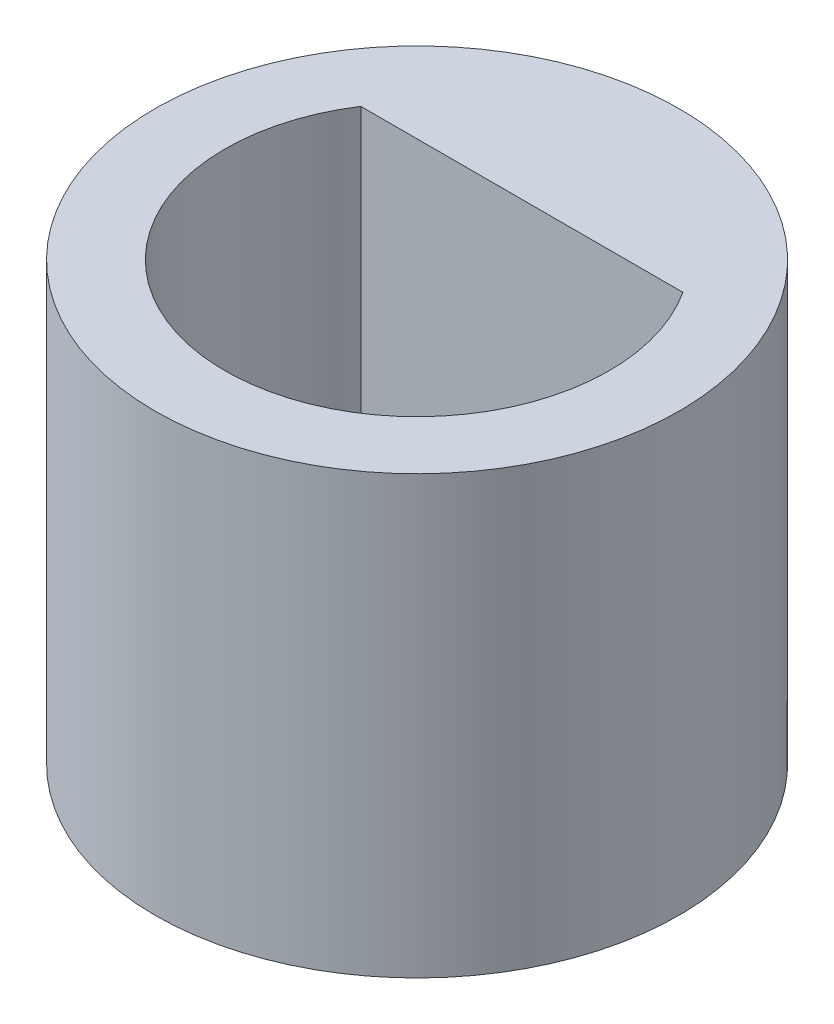
ISO-10303-21;
HEADER;
FILE_DESCRIPTION(('STEP AP214'),'2;1');
FILE_NAME('part.step','',(''),(''),'','','');
FILE_SCHEMA(('AUTOMOTIVE_DESIGN { 1 0 10303 214 1 1 1 1 }'));
ENDSEC;
DATA;
#1=APPLICATION_CONTEXT('core data for automotive mechanical design processes');
#2=APPLICATION_PROTOCOL_DEFINITION('international standard','automotive_design',2000,#1);
#3=PRODUCT_CONTEXT('',#1,'mechanical');
#4=PRODUCT('Part','Part','',(#3));
#5=PRODUCT_RELATED_PRODUCT_CATEGORY('part','',(#4));
#6=PRODUCT_DEFINITION_FORMATION('','',#4);
#7=PRODUCT_DEFINITION_CONTEXT('part definition',#1,'design');
#8=PRODUCT_DEFINITION('design','',#6,#7);
#9=PRODUCT_DEFINITION_SHAPE('','',#8);
#10=(LENGTH_UNIT() NAMED_UNIT(*) SI_UNIT(.MILLI.,.METRE.));
#11=(NAMED_UNIT(*) PLANE_ANGLE_UNIT() SI_UNIT($,.RADIAN.));
#12=(NAMED_UNIT(*) SI_UNIT($,.STERADIAN.) SOLID_ANGLE_UNIT());
#13=UNCERTAINTY_MEASURE_WITH_UNIT(LENGTH_MEASURE(1.E-05),#10,'distance_accuracy_value','');
#14=(GEOMETRIC_REPRESENTATION_CONTEXT(3) GLOBAL_UNCERTAINTY_ASSIGNED_CONTEXT((#13)) GLOBAL_UNIT_ASSIGNED_CONTEXT((#10,
#11,#12)) REPRESENTATION_CONTEXT('',''));
#15=CARTESIAN_POINT('',(0.,0.,0.));
#16=DIRECTION('',(0.,0.,1.));
#17=DIRECTION('',(1.,0.,0.));
#18=AXIS2_PLACEMENT_3D('',#15,#16,#17);
#19=CARTESIAN_POINT('',(0.,5.,0.));
#20=DIRECTION('',(0.,1.,0.));
#21=DIRECTION('',(0.,0.,1.));
#22=AXIS2_PLACEMENT_3D('',#19,#20,#21);
#23=PLANE('',#22);
#24=CARTESIAN_POINT('',(0.,5.,0.));
#25=DIRECTION('',(0.,1.,0.));
#26=DIRECTION('',(0.,0.,1.));
#27=AXIS2_PLACEMENT_3D('',#24,#25,#26);
#28=CIRCLE('',#27,3.);
#29=CARTESIAN_POINT('',(0.,5.,3.));
#30=VERTEX_POINT('',#29);
#31=EDGE_CURVE('E11',#30,#30,#28,.T.);
#32=ORIENTED_EDGE('',*,*,#31,.T.);
#33=EDGE_LOOP('',(#32));
#34=FACE_BOUND('',#33,.T.);
#35=DIRECTION('',(-1.,0.,0.));
#36=VECTOR('',#35,1.);
#37=CARTESIAN_POINT('',(-1.84390889145858,5.,-1.2));
#38=LINE('',#37,#36);
#39=CARTESIAN_POINT('',(1.84390889145858,5.,-1.2));
#40=VERTEX_POINT('',#39);
#41=CARTESIAN_POINT('',(-1.84390889145858,5.,-1.2));
#42=VERTEX_POINT('',#41);
#43=EDGE_CURVE('E84',#40,#42,#38,.T.);
#44=ORIENTED_EDGE('',*,*,#43,.F.);
#45=CARTESIAN_POINT('',(0.,5.,0.));
#46=DIRECTION('',(0.,1.,0.));
#47=DIRECTION('',(0.,0.,1.));
#48=AXIS2_PLACEMENT_3D('',#45,#46,#47);
#49=CIRCLE('',#48,2.2);
#50=EDGE_CURVE('E73',#42,#40,#49,.T.);
#51=ORIENTED_EDGE('',*,*,#50,.F.);
#52=EDGE_LOOP('',(#44,#51));
#53=FACE_BOUND('',#52,.T.);
#54=ADVANCED_FACE('F39',(#34,#53),#23,.T.);
#55=CARTESIAN_POINT('',(0.,0.,0.));
#56=DIRECTION('',(0.,1.,0.));
#57=DIRECTION('',(0.,0.,1.));
#58=AXIS2_PLACEMENT_3D('',#55,#56,#57);
#59=PLANE('',#58);
#60=CARTESIAN_POINT('',(0.,0.,0.));
#61=DIRECTION('',(0.,1.,0.));
#62=DIRECTION('',(0.,0.,1.));
#63=AXIS2_PLACEMENT_3D('',#60,#61,#62);
#64=CIRCLE('',#63,3.);
#65=CARTESIAN_POINT('',(0.,0.,3.));
#66=VERTEX_POINT('',#65);
#67=EDGE_CURVE('E43',#66,#66,#64,.T.);
#68=ORIENTED_EDGE('',*,*,#67,.F.);
#69=EDGE_LOOP('',(#68));
#70=FACE_BOUND('',#69,.T.);
#71=CARTESIAN_POINT('',(0.,0.,0.));
#72=DIRECTION('',(0.,1.,0.));
#73=DIRECTION('',(0.,0.,1.));
#74=AXIS2_PLACEMENT_3D('',#71,#72,#73);
#75=CIRCLE('',#74,2.2);
#76=CARTESIAN_POINT('',(-1.84390889145858,0.,-1.2));
#77=VERTEX_POINT('',#76);
#78=CARTESIAN_POINT('',(1.84390889145858,0.,-1.2));
#79=VERTEX_POINT('',#78);
#80=EDGE_CURVE('E62',#77,#79,#75,.T.);
#81=ORIENTED_EDGE('',*,*,#80,.T.);
#82=DIRECTION('',(-1.,0.,0.));
#83=VECTOR('',#82,1.);
#84=CARTESIAN_POINT('',(-1.84390889145858,0.,-1.2));
#85=LINE('',#84,#83);
#86=EDGE_CURVE('E68',#79,#77,#85,.T.);
#87=ORIENTED_EDGE('',*,*,#86,.T.);
#88=EDGE_LOOP('',(#81,#87));
#89=FACE_BOUND('',#88,.T.);
#90=ADVANCED_FACE('F80',(#70,#89),#59,.F.);
#91=CARTESIAN_POINT('',(0.,5.,0.));
#92=DIRECTION('',(0.,-1.,0.));
#93=DIRECTION('',(0.,0.,-1.));
#94=AXIS2_PLACEMENT_3D('',#91,#92,#93);
#95=CYLINDRICAL_SURFACE('',#94,3.);
#96=ORIENTED_EDGE('',*,*,#31,.F.);
#97=EDGE_LOOP('',(#96));
#98=FACE_BOUND('',#97,.T.);
#99=ORIENTED_EDGE('',*,*,#67,.T.);
#100=EDGE_LOOP('',(#99));
#101=FACE_BOUND('',#100,.T.);
#102=ADVANCED_FACE('F41',(#98,#101),#95,.T.);
#103=CARTESIAN_POINT('',(0.,5.,0.));
#104=DIRECTION('',(0.,-1.,0.));
#105=DIRECTION('',(0.,0.,-1.));
#106=AXIS2_PLACEMENT_3D('',#103,#104,#105);
#107=CYLINDRICAL_SURFACE('',#106,2.2);
#108=ORIENTED_EDGE('',*,*,#80,.F.);
#109=DIRECTION('',(0.,-1.,0.));
#110=VECTOR('',#109,1.);
#111=CARTESIAN_POINT('',(-1.84390889145858,5.,-1.2));
#112=LINE('',#111,#110);
#113=EDGE_CURVE('E70',#42,#77,#112,.T.);
#114=ORIENTED_EDGE('',*,*,#113,.F.);
#115=ORIENTED_EDGE('',*,*,#50,.T.);
#116=DIRECTION('',(0.,-1.,0.));
#117=VECTOR('',#116,1.);
#118=CARTESIAN_POINT('',(1.84390889145858,5.,-1.2));
#119=LINE('',#118,#117);
#120=EDGE_CURVE('E55',#40,#79,#119,.T.);
#121=ORIENTED_EDGE('',*,*,#120,.T.);
#122=EDGE_LOOP('',(#108,#114,#115,#121));
#123=FACE_BOUND('',#122,.T.);
#124=ADVANCED_FACE('F75',(#123),#107,.F.);
#125=CARTESIAN_POINT('',(-1.84390889145858,5.,-1.2));
#126=DIRECTION('',(0.,0.,1.));
#127=DIRECTION('',(1.,0.,0.));
#128=AXIS2_PLACEMENT_3D('',#125,#126,#127);
#129=PLANE('',#128);
#130=ORIENTED_EDGE('',*,*,#86,.F.);
#131=ORIENTED_EDGE('',*,*,#120,.F.);
#132=ORIENTED_EDGE('',*,*,#43,.T.);
#133=ORIENTED_EDGE('',*,*,#113,.T.);
#134=EDGE_LOOP('',(#130,#131,#132,#133));
#135=FACE_BOUND('',#134,.T.);
#136=ADVANCED_FACE('F69',(#135),#129,.T.);
#137=CLOSED_SHELL('',(#54,#90,#102,#124,#136));
#138=MANIFOLD_SOLID_BREP('B2',#137);
#139=ADVANCED_BREP_SHAPE_REPRESENTATION('',(#18,#138),#14);
#140=SHAPE_DEFINITION_REPRESENTATION(#9,#139);
ENDSEC;
END-ISO-10303-21;
